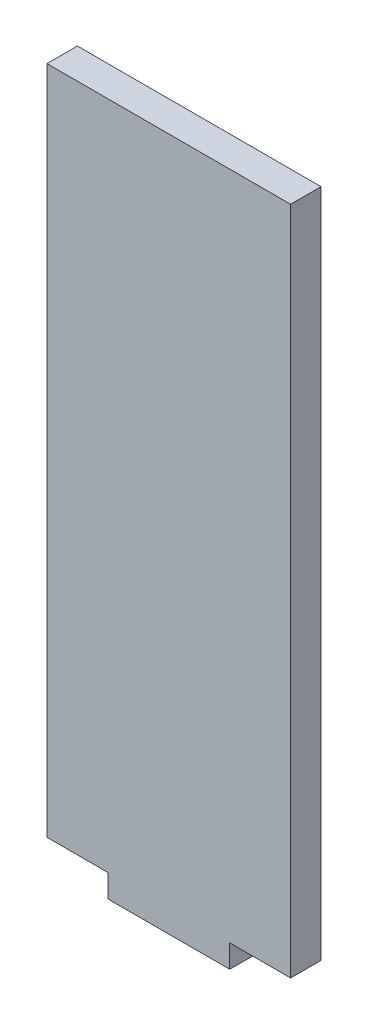
ISO-10303-21;
HEADER;
FILE_DESCRIPTION(('STEP AP214'),'2;1');
FILE_NAME('part.step','',(''),(''),'','','');
FILE_SCHEMA(('AUTOMOTIVE_DESIGN { 1 0 10303 214 1 1 1 1 }'));
ENDSEC;
DATA;
#1=APPLICATION_CONTEXT('core data for automotive mechanical design processes');
#2=APPLICATION_PROTOCOL_DEFINITION('international standard','automotive_design',2000,#1);
#3=PRODUCT_CONTEXT('',#1,'mechanical');
#4=PRODUCT('Part','Part','',(#3));
#5=PRODUCT_RELATED_PRODUCT_CATEGORY('part','',(#4));
#6=PRODUCT_DEFINITION_FORMATION('','',#4);
#7=PRODUCT_DEFINITION_CONTEXT('part definition',#1,'design');
#8=PRODUCT_DEFINITION('design','',#6,#7);
#9=PRODUCT_DEFINITION_SHAPE('','',#8);
#10=(LENGTH_UNIT() NAMED_UNIT(*) SI_UNIT(.MILLI.,.METRE.));
#11=(NAMED_UNIT(*) PLANE_ANGLE_UNIT() SI_UNIT($,.RADIAN.));
#12=(NAMED_UNIT(*) SI_UNIT($,.STERADIAN.) SOLID_ANGLE_UNIT());
#13=UNCERTAINTY_MEASURE_WITH_UNIT(LENGTH_MEASURE(1.E-05),#10,'distance_accuracy_value','');
#14=(GEOMETRIC_REPRESENTATION_CONTEXT(3) GLOBAL_UNCERTAINTY_ASSIGNED_CONTEXT((#13)) GLOBAL_UNIT_ASSIGNED_CONTEXT((#10,
#11,#12)) REPRESENTATION_CONTEXT('',''));
#15=CARTESIAN_POINT('',(0.,0.,0.));
#16=DIRECTION('',(0.,0.,1.));
#17=DIRECTION('',(1.,0.,0.));
#18=AXIS2_PLACEMENT_3D('',#15,#16,#17);
#19=CARTESIAN_POINT('',(0.,0.,3.175));
#20=DIRECTION('',(1.,0.,0.));
#21=DIRECTION('',(0.,1.,0.));
#22=AXIS2_PLACEMENT_3D('',#19,#20,#21);
#23=PLANE('',#22);
#24=DIRECTION('',(0.,-1.,0.));
#25=VECTOR('',#24,1.);
#26=CARTESIAN_POINT('',(0.,0.,0.));
#27=LINE('',#26,#25);
#28=CARTESIAN_POINT('',(0.,69.85,0.));
#29=VERTEX_POINT('',#28);
#30=CARTESIAN_POINT('',(0.,0.,0.));
#31=VERTEX_POINT('',#30);
#32=EDGE_CURVE('E129',#29,#31,#27,.T.);
#33=ORIENTED_EDGE('',*,*,#32,.T.);
#34=DIRECTION('',(0.,0.,-1.));
#35=VECTOR('',#34,1.);
#36=CARTESIAN_POINT('',(0.,0.,3.175));
#37=LINE('',#36,#35);
#38=CARTESIAN_POINT('',(0.,0.,3.175));
#39=VERTEX_POINT('',#38);
#40=EDGE_CURVE('E11',#39,#31,#37,.T.);
#41=ORIENTED_EDGE('',*,*,#40,.F.);
#42=DIRECTION('',(0.,-1.,0.));
#43=VECTOR('',#42,1.);
#44=CARTESIAN_POINT('',(0.,0.,3.175));
#45=LINE('',#44,#43);
#46=CARTESIAN_POINT('',(0.,69.85,3.175));
#47=VERTEX_POINT('',#46);
#48=EDGE_CURVE('E143',#47,#39,#45,.T.);
#49=ORIENTED_EDGE('',*,*,#48,.F.);
#50=DIRECTION('',(0.,0.,-1.));
#51=VECTOR('',#50,1.);
#52=CARTESIAN_POINT('',(0.,69.85,3.175));
#53=LINE('',#52,#51);
#54=EDGE_CURVE('E125',#47,#29,#53,.T.);
#55=ORIENTED_EDGE('',*,*,#54,.T.);
#56=EDGE_LOOP('',(#33,#41,#49,#55));
#57=FACE_BOUND('',#56,.T.);
#58=ADVANCED_FACE('F33',(#57),#23,.F.);
#59=CARTESIAN_POINT('',(0.,0.,3.175));
#60=DIRECTION('',(0.,1.,0.));
#61=DIRECTION('',(0.,0.,1.));
#62=AXIS2_PLACEMENT_3D('',#59,#60,#61);
#63=PLANE('',#62);
#64=DIRECTION('',(1.,0.,0.));
#65=VECTOR('',#64,1.);
#66=CARTESIAN_POINT('',(0.,0.,0.));
#67=LINE('',#66,#65);
#68=CARTESIAN_POINT('',(6.35,0.,0.));
#69=VERTEX_POINT('',#68);
#70=EDGE_CURVE('E132',#31,#69,#67,.T.);
#71=ORIENTED_EDGE('',*,*,#70,.T.);
#72=DIRECTION('',(0.,0.,-1.));
#73=VECTOR('',#72,1.);
#74=CARTESIAN_POINT('',(6.35,0.,3.175));
#75=LINE('',#74,#73);
#76=CARTESIAN_POINT('',(6.35,0.,3.175));
#77=VERTEX_POINT('',#76);
#78=EDGE_CURVE('E41',#77,#69,#75,.T.);
#79=ORIENTED_EDGE('',*,*,#78,.F.);
#80=DIRECTION('',(1.,0.,0.));
#81=VECTOR('',#80,1.);
#82=CARTESIAN_POINT('',(0.,0.,3.175));
#83=LINE('',#82,#81);
#84=EDGE_CURVE('E92',#39,#77,#83,.T.);
#85=ORIENTED_EDGE('',*,*,#84,.F.);
#86=ORIENTED_EDGE('',*,*,#40,.T.);
#87=EDGE_LOOP('',(#71,#79,#85,#86));
#88=FACE_BOUND('',#87,.T.);
#89=ADVANCED_FACE('F178',(#88),#63,.F.);
#90=CARTESIAN_POINT('',(6.35,0.,3.175));
#91=DIRECTION('',(1.,0.,0.));
#92=DIRECTION('',(0.,0.,-1.));
#93=AXIS2_PLACEMENT_3D('',#90,#91,#92);
#94=PLANE('',#93);
#95=DIRECTION('',(0.,-1.,0.));
#96=VECTOR('',#95,1.);
#97=CARTESIAN_POINT('',(6.35,0.,0.));
#98=LINE('',#97,#96);
#99=CARTESIAN_POINT('',(6.35,-2.38793491823931,0.));
#100=VERTEX_POINT('',#99);
#101=EDGE_CURVE('E134',#69,#100,#98,.T.);
#102=ORIENTED_EDGE('',*,*,#101,.T.);
#103=DIRECTION('',(0.,0.,-1.));
#104=VECTOR('',#103,1.);
#105=CARTESIAN_POINT('',(6.35,-2.38793491823931,3.175));
#106=LINE('',#105,#104);
#107=CARTESIAN_POINT('',(6.35,-2.38793491823931,3.175));
#108=VERTEX_POINT('',#107);
#109=EDGE_CURVE('E150',#108,#100,#106,.T.);
#110=ORIENTED_EDGE('',*,*,#109,.F.);
#111=DIRECTION('',(0.,-1.,0.));
#112=VECTOR('',#111,1.);
#113=CARTESIAN_POINT('',(6.35,0.,3.175));
#114=LINE('',#113,#112);
#115=EDGE_CURVE('E158',#77,#108,#114,.T.);
#116=ORIENTED_EDGE('',*,*,#115,.F.);
#117=ORIENTED_EDGE('',*,*,#78,.T.);
#118=EDGE_LOOP('',(#102,#110,#116,#117));
#119=FACE_BOUND('',#118,.T.);
#120=ADVANCED_FACE('F156',(#119),#94,.F.);
#121=CARTESIAN_POINT('',(6.35,-2.38793491823931,3.175));
#122=DIRECTION('',(0.,1.,0.));
#123=DIRECTION('',(0.,0.,1.));
#124=AXIS2_PLACEMENT_3D('',#121,#122,#123);
#125=PLANE('',#124);
#126=DIRECTION('',(1.,0.,0.));
#127=VECTOR('',#126,1.);
#128=CARTESIAN_POINT('',(6.35,-2.38793491823931,0.));
#129=LINE('',#128,#127);
#130=CARTESIAN_POINT('',(19.05,-2.38793491823931,0.));
#131=VERTEX_POINT('',#130);
#132=EDGE_CURVE('E136',#100,#131,#129,.T.);
#133=ORIENTED_EDGE('',*,*,#132,.T.);
#134=DIRECTION('',(0.,0.,-1.));
#135=VECTOR('',#134,1.);
#136=CARTESIAN_POINT('',(19.05,-2.38793491823931,3.175));
#137=LINE('',#136,#135);
#138=CARTESIAN_POINT('',(19.05,-2.38793491823931,3.175));
#139=VERTEX_POINT('',#138);
#140=EDGE_CURVE('E147',#139,#131,#137,.T.);
#141=ORIENTED_EDGE('',*,*,#140,.F.);
#142=DIRECTION('',(1.,0.,0.));
#143=VECTOR('',#142,1.);
#144=CARTESIAN_POINT('',(6.35,-2.38793491823931,3.175));
#145=LINE('',#144,#143);
#146=EDGE_CURVE('E170',#108,#139,#145,.T.);
#147=ORIENTED_EDGE('',*,*,#146,.F.);
#148=ORIENTED_EDGE('',*,*,#109,.T.);
#149=EDGE_LOOP('',(#133,#141,#147,#148));
#150=FACE_BOUND('',#149,.T.);
#151=ADVANCED_FACE('F166',(#150),#125,.F.);
#152=CARTESIAN_POINT('',(19.05,-2.38793491823931,3.175));
#153=DIRECTION('',(-1.,0.,0.));
#154=DIRECTION('',(0.,0.,1.));
#155=AXIS2_PLACEMENT_3D('',#152,#153,#154);
#156=PLANE('',#155);
#157=DIRECTION('',(0.,1.,0.));
#158=VECTOR('',#157,1.);
#159=CARTESIAN_POINT('',(19.05,-2.38793491823931,0.));
#160=LINE('',#159,#158);
#161=CARTESIAN_POINT('',(19.05,0.,0.));
#162=VERTEX_POINT('',#161);
#163=EDGE_CURVE('E138',#131,#162,#160,.T.);
#164=ORIENTED_EDGE('',*,*,#163,.T.);
#165=DIRECTION('',(0.,0.,-1.));
#166=VECTOR('',#165,1.);
#167=CARTESIAN_POINT('',(19.05,0.,3.175));
#168=LINE('',#167,#166);
#169=CARTESIAN_POINT('',(19.05,0.,3.175));
#170=VERTEX_POINT('',#169);
#171=EDGE_CURVE('E120',#170,#162,#168,.T.);
#172=ORIENTED_EDGE('',*,*,#171,.F.);
#173=DIRECTION('',(0.,1.,0.));
#174=VECTOR('',#173,1.);
#175=CARTESIAN_POINT('',(19.05,-2.38793491823931,3.175));
#176=LINE('',#175,#174);
#177=EDGE_CURVE('E111',#139,#170,#176,.T.);
#178=ORIENTED_EDGE('',*,*,#177,.F.);
#179=ORIENTED_EDGE('',*,*,#140,.T.);
#180=EDGE_LOOP('',(#164,#172,#178,#179));
#181=FACE_BOUND('',#180,.T.);
#182=ADVANCED_FACE('F169',(#181),#156,.F.);
#183=CARTESIAN_POINT('',(19.05,0.,3.175));
#184=DIRECTION('',(0.,1.,0.));
#185=DIRECTION('',(0.,0.,1.));
#186=AXIS2_PLACEMENT_3D('',#183,#184,#185);
#187=PLANE('',#186);
#188=DIRECTION('',(1.,0.,0.));
#189=VECTOR('',#188,1.);
#190=CARTESIAN_POINT('',(19.05,0.,0.));
#191=LINE('',#190,#189);
#192=CARTESIAN_POINT('',(25.4,0.,0.));
#193=VERTEX_POINT('',#192);
#194=EDGE_CURVE('E119',#162,#193,#191,.T.);
#195=ORIENTED_EDGE('',*,*,#194,.T.);
#196=DIRECTION('',(0.,0.,-1.));
#197=VECTOR('',#196,1.);
#198=CARTESIAN_POINT('',(25.4,0.,3.175));
#199=LINE('',#198,#197);
#200=CARTESIAN_POINT('',(25.4,0.,3.175));
#201=VERTEX_POINT('',#200);
#202=EDGE_CURVE('E116',#201,#193,#199,.T.);
#203=ORIENTED_EDGE('',*,*,#202,.F.);
#204=DIRECTION('',(1.,0.,0.));
#205=VECTOR('',#204,1.);
#206=CARTESIAN_POINT('',(19.05,0.,3.175));
#207=LINE('',#206,#205);
#208=EDGE_CURVE('E105',#170,#201,#207,.T.);
#209=ORIENTED_EDGE('',*,*,#208,.F.);
#210=ORIENTED_EDGE('',*,*,#171,.T.);
#211=EDGE_LOOP('',(#195,#203,#209,#210));
#212=FACE_BOUND('',#211,.T.);
#213=ADVANCED_FACE('F117',(#212),#187,.F.);
#214=CARTESIAN_POINT('',(25.4,0.,3.175));
#215=DIRECTION('',(-1.,0.,0.));
#216=DIRECTION('',(0.,-1.,0.));
#217=AXIS2_PLACEMENT_3D('',#214,#215,#216);
#218=PLANE('',#217);
#219=DIRECTION('',(0.,1.,0.));
#220=VECTOR('',#219,1.);
#221=CARTESIAN_POINT('',(25.4,0.,0.));
#222=LINE('',#221,#220);
#223=CARTESIAN_POINT('',(25.4,69.85,0.));
#224=VERTEX_POINT('',#223);
#225=EDGE_CURVE('E78',#193,#224,#222,.T.);
#226=ORIENTED_EDGE('',*,*,#225,.T.);
#227=DIRECTION('',(0.,0.,-1.));
#228=VECTOR('',#227,1.);
#229=CARTESIAN_POINT('',(25.4,69.85,3.175));
#230=LINE('',#229,#228);
#231=CARTESIAN_POINT('',(25.4,69.85,3.175));
#232=VERTEX_POINT('',#231);
#233=EDGE_CURVE('E121',#232,#224,#230,.T.);
#234=ORIENTED_EDGE('',*,*,#233,.F.);
#235=DIRECTION('',(0.,1.,0.));
#236=VECTOR('',#235,1.);
#237=CARTESIAN_POINT('',(25.4,0.,3.175));
#238=LINE('',#237,#236);
#239=EDGE_CURVE('E109',#201,#232,#238,.T.);
#240=ORIENTED_EDGE('',*,*,#239,.F.);
#241=ORIENTED_EDGE('',*,*,#202,.T.);
#242=EDGE_LOOP('',(#226,#234,#240,#241));
#243=FACE_BOUND('',#242,.T.);
#244=ADVANCED_FACE('F123',(#243),#218,.F.);
#245=CARTESIAN_POINT('',(0.,69.85,3.175));
#246=DIRECTION('',(0.,-1.,0.));
#247=DIRECTION('',(0.,0.,-1.));
#248=AXIS2_PLACEMENT_3D('',#245,#246,#247);
#249=PLANE('',#248);
#250=DIRECTION('',(-1.,0.,0.));
#251=VECTOR('',#250,1.);
#252=CARTESIAN_POINT('',(0.,69.85,0.));
#253=LINE('',#252,#251);
#254=EDGE_CURVE('E84',#224,#29,#253,.T.);
#255=ORIENTED_EDGE('',*,*,#254,.T.);
#256=ORIENTED_EDGE('',*,*,#54,.F.);
#257=DIRECTION('',(-1.,0.,0.));
#258=VECTOR('',#257,1.);
#259=CARTESIAN_POINT('',(0.,69.85,3.175));
#260=LINE('',#259,#258);
#261=EDGE_CURVE('E49',#232,#47,#260,.T.);
#262=ORIENTED_EDGE('',*,*,#261,.F.);
#263=ORIENTED_EDGE('',*,*,#233,.T.);
#264=EDGE_LOOP('',(#255,#256,#262,#263));
#265=FACE_BOUND('',#264,.T.);
#266=ADVANCED_FACE('F194',(#265),#249,.F.);
#267=CARTESIAN_POINT('',(0.,0.,3.175));
#268=DIRECTION('',(0.,0.,-1.));
#269=DIRECTION('',(-1.,0.,0.));
#270=AXIS2_PLACEMENT_3D('',#267,#268,#269);
#271=PLANE('',#270);
#272=ORIENTED_EDGE('',*,*,#48,.T.);
#273=ORIENTED_EDGE('',*,*,#84,.T.);
#274=ORIENTED_EDGE('',*,*,#115,.T.);
#275=ORIENTED_EDGE('',*,*,#146,.T.);
#276=ORIENTED_EDGE('',*,*,#177,.T.);
#277=ORIENTED_EDGE('',*,*,#208,.T.);
#278=ORIENTED_EDGE('',*,*,#239,.T.);
#279=ORIENTED_EDGE('',*,*,#261,.T.);
#280=EDGE_LOOP('',(#272,#273,#274,#275,#276,#277,#278,#279));
#281=FACE_BOUND('',#280,.T.);
#282=ADVANCED_FACE('F107',(#281),#271,.F.);
#283=CARTESIAN_POINT('',(0.,0.,0.));
#284=DIRECTION('',(0.,0.,-1.));
#285=DIRECTION('',(-1.,0.,0.));
#286=AXIS2_PLACEMENT_3D('',#283,#284,#285);
#287=PLANE('',#286);
#288=ORIENTED_EDGE('',*,*,#32,.F.);
#289=ORIENTED_EDGE('',*,*,#254,.F.);
#290=ORIENTED_EDGE('',*,*,#225,.F.);
#291=ORIENTED_EDGE('',*,*,#194,.F.);
#292=ORIENTED_EDGE('',*,*,#163,.F.);
#293=ORIENTED_EDGE('',*,*,#132,.F.);
#294=ORIENTED_EDGE('',*,*,#101,.F.);
#295=ORIENTED_EDGE('',*,*,#70,.F.);
#296=EDGE_LOOP('',(#288,#289,#290,#291,#292,#293,#294,#295));
#297=FACE_BOUND('',#296,.T.);
#298=ADVANCED_FACE('F162',(#297),#287,.T.);
#299=CLOSED_SHELL('',(#58,#89,#120,#151,#182,#213,#244,#266,#282,#298));
#300=MANIFOLD_SOLID_BREP('B2',#299);
#301=ADVANCED_BREP_SHAPE_REPRESENTATION('',(#18,#300),#14);
#302=SHAPE_DEFINITION_REPRESENTATION(#9,#301);
ENDSEC;
END-ISO-10303-21;
